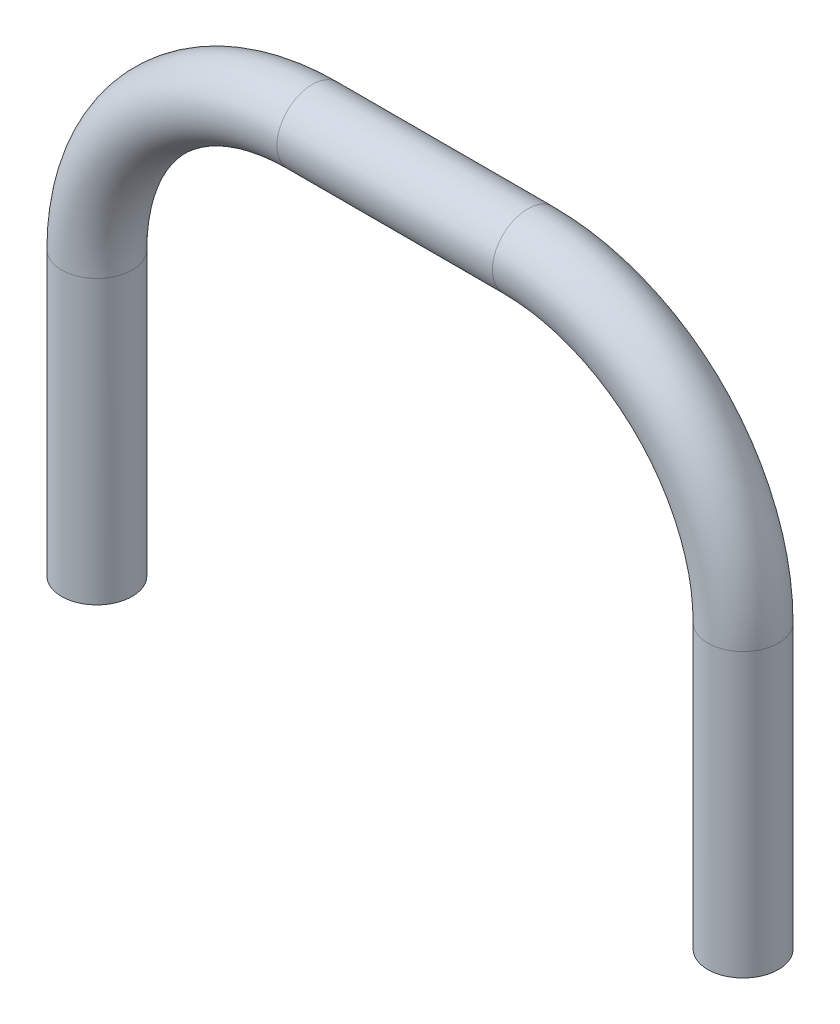
ISO-10303-21;
HEADER;
FILE_DESCRIPTION(('STEP AP214'),'2;1');
FILE_NAME('part.step','',(''),(''),'','','');
FILE_SCHEMA(('AUTOMOTIVE_DESIGN { 1 0 10303 214 1 1 1 1 }'));
ENDSEC;
DATA;
#1=APPLICATION_CONTEXT('core data for automotive mechanical design processes');
#2=APPLICATION_PROTOCOL_DEFINITION('international standard','automotive_design',2000,#1);
#3=PRODUCT_CONTEXT('',#1,'mechanical');
#4=PRODUCT('Part','Part','',(#3));
#5=PRODUCT_RELATED_PRODUCT_CATEGORY('part','',(#4));
#6=PRODUCT_DEFINITION_FORMATION('','',#4);
#7=PRODUCT_DEFINITION_CONTEXT('part definition',#1,'design');
#8=PRODUCT_DEFINITION('design','',#6,#7);
#9=PRODUCT_DEFINITION_SHAPE('','',#8);
#10=(LENGTH_UNIT() NAMED_UNIT(*) SI_UNIT(.MILLI.,.METRE.));
#11=(NAMED_UNIT(*) PLANE_ANGLE_UNIT() SI_UNIT($,.RADIAN.));
#12=(NAMED_UNIT(*) SI_UNIT($,.STERADIAN.) SOLID_ANGLE_UNIT());
#13=UNCERTAINTY_MEASURE_WITH_UNIT(LENGTH_MEASURE(1.E-05),#10,'distance_accuracy_value','');
#14=(GEOMETRIC_REPRESENTATION_CONTEXT(3) GLOBAL_UNCERTAINTY_ASSIGNED_CONTEXT((#13)) GLOBAL_UNIT_ASSIGNED_CONTEXT((#10,
#11,#12)) REPRESENTATION_CONTEXT('',''));
#15=CARTESIAN_POINT('',(0.,0.,0.));
#16=DIRECTION('',(0.,0.,1.));
#17=DIRECTION('',(1.,0.,0.));
#18=AXIS2_PLACEMENT_3D('',#15,#16,#17);
#19=CARTESIAN_POINT('',(609.6,266.7,0.));
#20=DIRECTION('',(0.,-1.,0.));
#21=DIRECTION('',(1.,0.,0.));
#22=AXIS2_PLACEMENT_3D('',#19,#20,#21);
#23=CYLINDRICAL_SURFACE('',#22,33.3375);
#24=CARTESIAN_POINT('',(609.6,266.7,0.));
#25=DIRECTION('',(0.,-1.,0.));
#26=DIRECTION('',(0.,0.,1.));
#27=AXIS2_PLACEMENT_3D('',#24,#25,#26);
#28=CIRCLE('',#27,33.3375);
#29=CARTESIAN_POINT('',(642.9375,266.7,0.));
#30=VERTEX_POINT('',#29);
#31=EDGE_CURVE('E38',#30,#30,#28,.T.);
#32=ORIENTED_EDGE('',*,*,#31,.T.);
#33=EDGE_LOOP('',(#32));
#34=FACE_BOUND('',#33,.T.);
#35=CARTESIAN_POINT('',(609.6,0.,0.));
#36=DIRECTION('',(0.,-1.,0.));
#37=DIRECTION('',(0.,0.,1.));
#38=AXIS2_PLACEMENT_3D('',#35,#36,#37);
#39=CIRCLE('',#38,33.3375);
#40=CARTESIAN_POINT('',(609.6,0.,33.3375));
#41=VERTEX_POINT('',#40);
#42=EDGE_CURVE('E10',#41,#41,#39,.T.);
#43=ORIENTED_EDGE('',*,*,#42,.F.);
#44=EDGE_LOOP('',(#43));
#45=FACE_BOUND('',#44,.T.);
#46=ADVANCED_FACE('F32',(#34,#45),#23,.T.);
#47=CARTESIAN_POINT('',(406.4,266.7,0.));
#48=DIRECTION('',(0.,0.,-1.));
#49=DIRECTION('',(-1.,0.,0.));
#50=AXIS2_PLACEMENT_3D('',#47,#48,#49);
#51=TOROIDAL_SURFACE('',#50,203.2,33.3375);
#52=CARTESIAN_POINT('',(406.4,469.9,0.));
#53=DIRECTION('',(1.,0.,0.));
#54=DIRECTION('',(0.,0.,1.));
#55=AXIS2_PLACEMENT_3D('',#52,#53,#54);
#56=CIRCLE('',#55,33.3375);
#57=CARTESIAN_POINT('',(406.4,503.2375,0.));
#58=VERTEX_POINT('',#57);
#59=EDGE_CURVE('E42',#58,#58,#56,.T.);
#60=CARTESIAN_POINT('',(406.4,266.7,0.));
#61=DIRECTION('',(0.,0.,-1.));
#62=DIRECTION('',(-1.,0.,0.));
#63=AXIS2_PLACEMENT_3D('',#60,#61,#62);
#64=CIRCLE('',#63,236.5375);
#65=EDGE_CURVE('',#58,#30,#64,.T.);
#66=ORIENTED_EDGE('',*,*,#59,.T.);
#67=ORIENTED_EDGE('',*,*,#31,.F.);
#68=ORIENTED_EDGE('',*,*,#65,.T.);
#69=ORIENTED_EDGE('',*,*,#65,.F.);
#70=EDGE_LOOP('',(#66,#68,#67,#69));
#71=FACE_BOUND('',#70,.T.);
#72=ADVANCED_FACE('F88',(#71),#51,.T.);
#73=CARTESIAN_POINT('',(203.2,469.9,0.));
#74=DIRECTION('',(1.,0.,0.));
#75=DIRECTION('',(0.,0.,-1.));
#76=AXIS2_PLACEMENT_3D('',#73,#74,#75);
#77=CYLINDRICAL_SURFACE('',#76,33.3375);
#78=CARTESIAN_POINT('',(203.2,469.9,0.));
#79=DIRECTION('',(1.,0.,0.));
#80=DIRECTION('',(0.,0.,1.));
#81=AXIS2_PLACEMENT_3D('',#78,#79,#80);
#82=CIRCLE('',#81,33.3375);
#83=CARTESIAN_POINT('',(203.2,503.2375,0.));
#84=VERTEX_POINT('',#83);
#85=EDGE_CURVE('E46',#84,#84,#82,.T.);
#86=ORIENTED_EDGE('',*,*,#85,.T.);
#87=EDGE_LOOP('',(#86));
#88=FACE_BOUND('',#87,.T.);
#89=ORIENTED_EDGE('',*,*,#59,.F.);
#90=EDGE_LOOP('',(#89));
#91=FACE_BOUND('',#90,.T.);
#92=ADVANCED_FACE('F92',(#88,#91),#77,.T.);
#93=CARTESIAN_POINT('',(203.2,266.7,0.));
#94=DIRECTION('',(0.,0.,-1.));
#95=DIRECTION('',(-1.,0.,0.));
#96=AXIS2_PLACEMENT_3D('',#93,#94,#95);
#97=TOROIDAL_SURFACE('',#96,203.2,33.3375);
#98=CARTESIAN_POINT('',(0.,266.7,0.));
#99=DIRECTION('',(0.,1.,0.));
#100=DIRECTION('',(0.,0.,1.));
#101=AXIS2_PLACEMENT_3D('',#98,#99,#100);
#102=CIRCLE('',#101,33.3375);
#103=CARTESIAN_POINT('',(-33.3375,266.7,0.));
#104=VERTEX_POINT('',#103);
#105=EDGE_CURVE('E51',#104,#104,#102,.T.);
#106=CARTESIAN_POINT('',(203.2,266.7,0.));
#107=DIRECTION('',(0.,0.,-1.));
#108=DIRECTION('',(-1.,0.,0.));
#109=AXIS2_PLACEMENT_3D('',#106,#107,#108);
#110=CIRCLE('',#109,236.5375);
#111=EDGE_CURVE('',#104,#84,#110,.T.);
#112=ORIENTED_EDGE('',*,*,#105,.T.);
#113=ORIENTED_EDGE('',*,*,#85,.F.);
#114=ORIENTED_EDGE('',*,*,#111,.T.);
#115=ORIENTED_EDGE('',*,*,#111,.F.);
#116=EDGE_LOOP('',(#112,#114,#113,#115));
#117=FACE_BOUND('',#116,.T.);
#118=ADVANCED_FACE('F84',(#117),#97,.T.);
#119=CARTESIAN_POINT('',(0.,266.7,0.));
#120=DIRECTION('',(0.,-1.,0.));
#121=DIRECTION('',(0.,0.,-1.));
#122=AXIS2_PLACEMENT_3D('',#119,#120,#121);
#123=CYLINDRICAL_SURFACE('',#122,33.3375);
#124=ORIENTED_EDGE('',*,*,#105,.F.);
#125=EDGE_LOOP('',(#124));
#126=FACE_BOUND('',#125,.T.);
#127=CARTESIAN_POINT('',(0.,0.,0.));
#128=DIRECTION('',(0.,1.,0.));
#129=DIRECTION('',(0.,0.,1.));
#130=AXIS2_PLACEMENT_3D('',#127,#128,#129);
#131=CIRCLE('',#130,33.3375);
#132=CARTESIAN_POINT('',(0.,0.,33.3375));
#133=VERTEX_POINT('',#132);
#134=EDGE_CURVE('E54',#133,#133,#131,.T.);
#135=ORIENTED_EDGE('',*,*,#134,.T.);
#136=EDGE_LOOP('',(#135));
#137=FACE_BOUND('',#136,.T.);
#138=ADVANCED_FACE('F75',(#126,#137),#123,.T.);
#139=CARTESIAN_POINT('',(609.6,0.,0.));
#140=DIRECTION('',(0.,-1.,0.));
#141=DIRECTION('',(0.,0.,1.));
#142=AXIS2_PLACEMENT_3D('',#139,#140,#141);
#143=PLANE('',#142);
#144=CARTESIAN_POINT('',(609.6,0.,0.));
#145=DIRECTION('',(0.,-1.,0.));
#146=DIRECTION('',(1.,0.,0.));
#147=AXIS2_PLACEMENT_3D('',#144,#145,#146);
#148=CIRCLE('',#147,23.8124999999999);
#149=CARTESIAN_POINT('',(633.4125,0.,0.));
#150=VERTEX_POINT('',#149);
#151=EDGE_CURVE('E66',#150,#150,#148,.T.);
#152=ORIENTED_EDGE('',*,*,#151,.F.);
#153=EDGE_LOOP('',(#152));
#154=FACE_BOUND('',#153,.T.);
#155=ORIENTED_EDGE('',*,*,#42,.T.);
#156=EDGE_LOOP('',(#155));
#157=FACE_BOUND('',#156,.T.);
#158=ADVANCED_FACE('F72',(#154,#157),#143,.T.);
#159=CARTESIAN_POINT('',(0.,0.,0.));
#160=DIRECTION('',(0.,1.,0.));
#161=DIRECTION('',(0.,0.,1.));
#162=AXIS2_PLACEMENT_3D('',#159,#160,#161);
#163=PLANE('',#162);
#164=CARTESIAN_POINT('',(0.,0.,0.));
#165=DIRECTION('',(0.,-1.,0.));
#166=DIRECTION('',(0.,0.,-1.));
#167=AXIS2_PLACEMENT_3D('',#164,#165,#166);
#168=CIRCLE('',#167,23.8125);
#169=CARTESIAN_POINT('',(0.,0.,-23.8125));
#170=VERTEX_POINT('',#169);
#171=EDGE_CURVE('E60',#170,#170,#168,.T.);
#172=ORIENTED_EDGE('',*,*,#171,.F.);
#173=EDGE_LOOP('',(#172));
#174=FACE_BOUND('',#173,.T.);
#175=ORIENTED_EDGE('',*,*,#134,.F.);
#176=EDGE_LOOP('',(#175));
#177=FACE_BOUND('',#176,.T.);
#178=ADVANCED_FACE('F74',(#174,#177),#163,.F.);
#179=CARTESIAN_POINT('',(0.,256.539999999999,0.));
#180=DIRECTION('',(0.,-1.,0.));
#181=DIRECTION('',(0.,0.,-1.));
#182=AXIS2_PLACEMENT_3D('',#179,#180,#181);
#183=CYLINDRICAL_SURFACE('',#182,23.8125);
#184=CARTESIAN_POINT('',(0.,256.539999999999,0.));
#185=DIRECTION('',(0.,-1.,0.));
#186=DIRECTION('',(0.,0.,-1.));
#187=AXIS2_PLACEMENT_3D('',#184,#185,#186);
#188=CIRCLE('',#187,23.8125);
#189=CARTESIAN_POINT('',(0.,256.539999999999,-23.8125));
#190=VERTEX_POINT('',#189);
#191=EDGE_CURVE('E57',#190,#190,#188,.T.);
#192=ORIENTED_EDGE('',*,*,#191,.F.);
#193=EDGE_LOOP('',(#192));
#194=FACE_BOUND('',#193,.T.);
#195=ORIENTED_EDGE('',*,*,#171,.T.);
#196=EDGE_LOOP('',(#195));
#197=FACE_BOUND('',#196,.T.);
#198=ADVANCED_FACE('F81',(#194,#197),#183,.F.);
#199=CARTESIAN_POINT('',(0.,256.539999999999,0.));
#200=DIRECTION('',(0.,-1.,0.));
#201=DIRECTION('',(0.,0.,-1.));
#202=AXIS2_PLACEMENT_3D('',#199,#200,#201);
#203=PLANE('',#202);
#204=ORIENTED_EDGE('',*,*,#191,.T.);
#205=EDGE_LOOP('',(#204));
#206=FACE_BOUND('',#205,.T.);
#207=ADVANCED_FACE('F133',(#206),#203,.T.);
#208=CARTESIAN_POINT('',(609.6,261.62,0.));
#209=DIRECTION('',(0.,-1.,0.));
#210=DIRECTION('',(1.,0.,0.));
#211=AXIS2_PLACEMENT_3D('',#208,#209,#210);
#212=CYLINDRICAL_SURFACE('',#211,23.8124999999999);
#213=CARTESIAN_POINT('',(609.6,261.62,0.));
#214=DIRECTION('',(0.,-1.,0.));
#215=DIRECTION('',(1.,0.,0.));
#216=AXIS2_PLACEMENT_3D('',#213,#214,#215);
#217=CIRCLE('',#216,23.8124999999999);
#218=CARTESIAN_POINT('',(633.4125,261.62,0.));
#219=VERTEX_POINT('',#218);
#220=EDGE_CURVE('E63',#219,#219,#217,.T.);
#221=ORIENTED_EDGE('',*,*,#220,.F.);
#222=EDGE_LOOP('',(#221));
#223=FACE_BOUND('',#222,.T.);
#224=ORIENTED_EDGE('',*,*,#151,.T.);
#225=EDGE_LOOP('',(#224));
#226=FACE_BOUND('',#225,.T.);
#227=ADVANCED_FACE('F70',(#223,#226),#212,.F.);
#228=CARTESIAN_POINT('',(609.6,261.62,0.));
#229=DIRECTION('',(0.,-1.,0.));
#230=DIRECTION('',(1.,0.,0.));
#231=AXIS2_PLACEMENT_3D('',#228,#229,#230);
#232=PLANE('',#231);
#233=ORIENTED_EDGE('',*,*,#220,.T.);
#234=EDGE_LOOP('',(#233));
#235=FACE_BOUND('',#234,.T.);
#236=ADVANCED_FACE('F132',(#235),#232,.T.);
#237=CLOSED_SHELL('',(#46,#72,#92,#118,#138,#158,#178,#198,#207,#227,#236));
#238=MANIFOLD_SOLID_BREP('B2',#237);
#239=ADVANCED_BREP_SHAPE_REPRESENTATION('',(#18,#238),#14);
#240=SHAPE_DEFINITION_REPRESENTATION(#9,#239);
ENDSEC;
END-ISO-10303-21;
